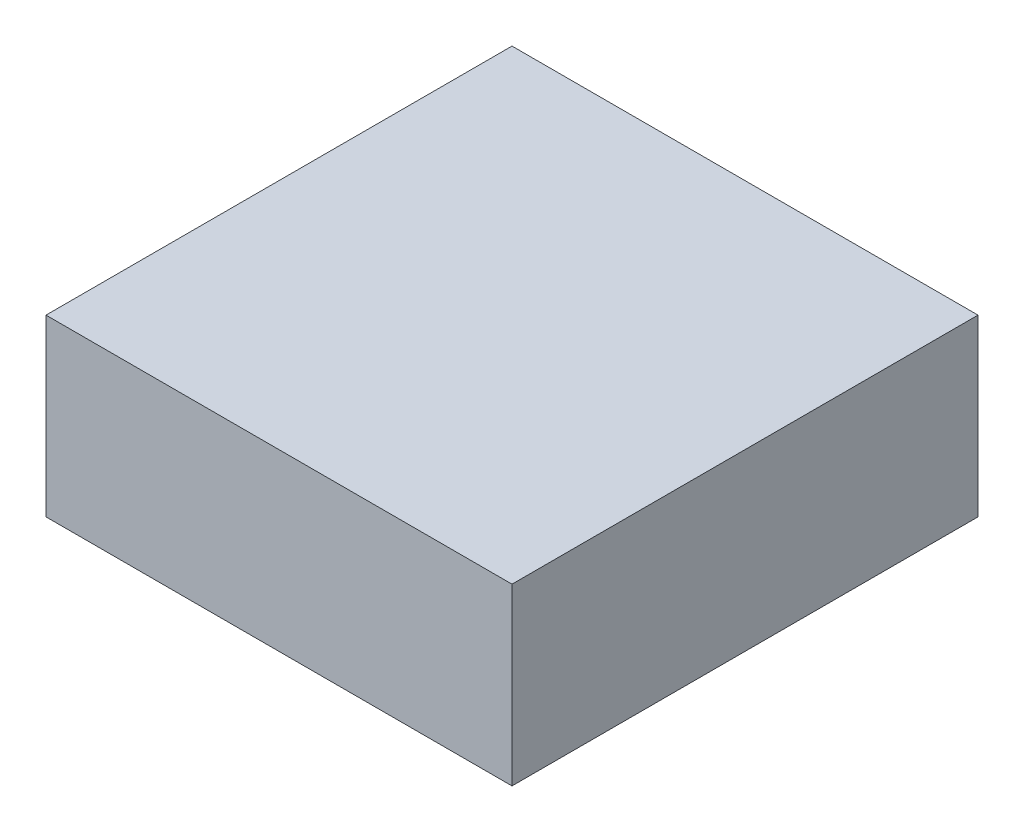
ISO-10303-21;
HEADER;
FILE_DESCRIPTION(('STEP AP214'),'2;1');
FILE_NAME('part.step','',(''),(''),'','','');
FILE_SCHEMA(('AUTOMOTIVE_DESIGN { 1 0 10303 214 1 1 1 1 }'));
ENDSEC;
DATA;
#1=APPLICATION_CONTEXT('core data for automotive mechanical design processes');
#2=APPLICATION_PROTOCOL_DEFINITION('international standard','automotive_design',2000,#1);
#3=PRODUCT_CONTEXT('',#1,'mechanical');
#4=PRODUCT('Part','Part','',(#3));
#5=PRODUCT_RELATED_PRODUCT_CATEGORY('part','',(#4));
#6=PRODUCT_DEFINITION_FORMATION('','',#4);
#7=PRODUCT_DEFINITION_CONTEXT('part definition',#1,'design');
#8=PRODUCT_DEFINITION('design','',#6,#7);
#9=PRODUCT_DEFINITION_SHAPE('','',#8);
#10=(LENGTH_UNIT() NAMED_UNIT(*) SI_UNIT(.MILLI.,.METRE.));
#11=(NAMED_UNIT(*) PLANE_ANGLE_UNIT() SI_UNIT($,.RADIAN.));
#12=(NAMED_UNIT(*) SI_UNIT($,.STERADIAN.) SOLID_ANGLE_UNIT());
#13=UNCERTAINTY_MEASURE_WITH_UNIT(LENGTH_MEASURE(1.E-05),#10,'distance_accuracy_value','');
#14=(GEOMETRIC_REPRESENTATION_CONTEXT(3) GLOBAL_UNCERTAINTY_ASSIGNED_CONTEXT((#13)) GLOBAL_UNIT_ASSIGNED_CONTEXT((#10,
#11,#12)) REPRESENTATION_CONTEXT('',''));
#15=CARTESIAN_POINT('',(0.,0.,0.));
#16=DIRECTION('',(0.,0.,1.));
#17=DIRECTION('',(1.,0.,0.));
#18=AXIS2_PLACEMENT_3D('',#15,#16,#17);
#19=CARTESIAN_POINT('',(16.,12.,-16.));
#20=DIRECTION('',(-1.,0.,0.));
#21=DIRECTION('',(0.,0.,1.));
#22=AXIS2_PLACEMENT_3D('',#19,#20,#21);
#23=PLANE('',#22);
#24=DIRECTION('',(0.,0.,-1.));
#25=VECTOR('',#24,1.);
#26=CARTESIAN_POINT('',(16.,0.,-16.));
#27=LINE('',#26,#25);
#28=CARTESIAN_POINT('',(16.,0.,16.));
#29=VERTEX_POINT('',#28);
#30=CARTESIAN_POINT('',(16.,0.,-16.));
#31=VERTEX_POINT('',#30);
#32=EDGE_CURVE('E100',#29,#31,#27,.T.);
#33=ORIENTED_EDGE('',*,*,#32,.T.);
#34=DIRECTION('',(0.,-1.,0.));
#35=VECTOR('',#34,1.);
#36=CARTESIAN_POINT('',(16.,12.,-16.));
#37=LINE('',#36,#35);
#38=CARTESIAN_POINT('',(16.,12.,-16.));
#39=VERTEX_POINT('',#38);
#40=EDGE_CURVE('E11',#39,#31,#37,.T.);
#41=ORIENTED_EDGE('',*,*,#40,.F.);
#42=DIRECTION('',(0.,0.,-1.));
#43=VECTOR('',#42,1.);
#44=CARTESIAN_POINT('',(16.,12.,-16.));
#45=LINE('',#44,#43);
#46=CARTESIAN_POINT('',(16.,12.,16.));
#47=VERTEX_POINT('',#46);
#48=EDGE_CURVE('E88',#47,#39,#45,.T.);
#49=ORIENTED_EDGE('',*,*,#48,.F.);
#50=DIRECTION('',(0.,-1.,0.));
#51=VECTOR('',#50,1.);
#52=CARTESIAN_POINT('',(16.,12.,16.));
#53=LINE('',#52,#51);
#54=EDGE_CURVE('E96',#47,#29,#53,.T.);
#55=ORIENTED_EDGE('',*,*,#54,.T.);
#56=EDGE_LOOP('',(#33,#41,#49,#55));
#57=FACE_BOUND('',#56,.T.);
#58=ADVANCED_FACE('F37',(#57),#23,.F.);
#59=CARTESIAN_POINT('',(-16.,12.,-16.));
#60=DIRECTION('',(0.,0.,1.));
#61=DIRECTION('',(1.,0.,0.));
#62=AXIS2_PLACEMENT_3D('',#59,#60,#61);
#63=PLANE('',#62);
#64=DIRECTION('',(-1.,0.,0.));
#65=VECTOR('',#64,1.);
#66=CARTESIAN_POINT('',(-16.,0.,-16.));
#67=LINE('',#66,#65);
#68=CARTESIAN_POINT('',(-16.,0.,-16.));
#69=VERTEX_POINT('',#68);
#70=EDGE_CURVE('E92',#31,#69,#67,.T.);
#71=ORIENTED_EDGE('',*,*,#70,.T.);
#72=DIRECTION('',(0.,-1.,0.));
#73=VECTOR('',#72,1.);
#74=CARTESIAN_POINT('',(-16.,12.,-16.));
#75=LINE('',#74,#73);
#76=CARTESIAN_POINT('',(-16.,12.,-16.));
#77=VERTEX_POINT('',#76);
#78=EDGE_CURVE('E45',#77,#69,#75,.T.);
#79=ORIENTED_EDGE('',*,*,#78,.F.);
#80=DIRECTION('',(-1.,0.,0.));
#81=VECTOR('',#80,1.);
#82=CARTESIAN_POINT('',(-16.,12.,-16.));
#83=LINE('',#82,#81);
#84=EDGE_CURVE('E83',#39,#77,#83,.T.);
#85=ORIENTED_EDGE('',*,*,#84,.F.);
#86=ORIENTED_EDGE('',*,*,#40,.T.);
#87=EDGE_LOOP('',(#71,#79,#85,#86));
#88=FACE_BOUND('',#87,.T.);
#89=ADVANCED_FACE('F91',(#88),#63,.F.);
#90=CARTESIAN_POINT('',(-16.,12.,-16.));
#91=DIRECTION('',(1.,0.,0.));
#92=DIRECTION('',(0.,0.,-1.));
#93=AXIS2_PLACEMENT_3D('',#90,#91,#92);
#94=PLANE('',#93);
#95=DIRECTION('',(0.,0.,1.));
#96=VECTOR('',#95,1.);
#97=CARTESIAN_POINT('',(-16.,0.,-16.));
#98=LINE('',#97,#96);
#99=CARTESIAN_POINT('',(-16.,0.,16.));
#100=VERTEX_POINT('',#99);
#101=EDGE_CURVE('E70',#69,#100,#98,.T.);
#102=ORIENTED_EDGE('',*,*,#101,.T.);
#103=DIRECTION('',(0.,-1.,0.));
#104=VECTOR('',#103,1.);
#105=CARTESIAN_POINT('',(-16.,12.,16.));
#106=LINE('',#105,#104);
#107=CARTESIAN_POINT('',(-16.,12.,16.));
#108=VERTEX_POINT('',#107);
#109=EDGE_CURVE('E93',#108,#100,#106,.T.);
#110=ORIENTED_EDGE('',*,*,#109,.F.);
#111=DIRECTION('',(0.,0.,1.));
#112=VECTOR('',#111,1.);
#113=CARTESIAN_POINT('',(-16.,12.,-16.));
#114=LINE('',#113,#112);
#115=EDGE_CURVE('E86',#77,#108,#114,.T.);
#116=ORIENTED_EDGE('',*,*,#115,.F.);
#117=ORIENTED_EDGE('',*,*,#78,.T.);
#118=EDGE_LOOP('',(#102,#110,#116,#117));
#119=FACE_BOUND('',#118,.T.);
#120=ADVANCED_FACE('F94',(#119),#94,.F.);
#121=CARTESIAN_POINT('',(-16.,12.,16.));
#122=DIRECTION('',(0.,0.,-1.));
#123=DIRECTION('',(-1.,0.,0.));
#124=AXIS2_PLACEMENT_3D('',#121,#122,#123);
#125=PLANE('',#124);
#126=DIRECTION('',(1.,0.,0.));
#127=VECTOR('',#126,1.);
#128=CARTESIAN_POINT('',(-16.,0.,16.));
#129=LINE('',#128,#127);
#130=EDGE_CURVE('E76',#100,#29,#129,.T.);
#131=ORIENTED_EDGE('',*,*,#130,.T.);
#132=ORIENTED_EDGE('',*,*,#54,.F.);
#133=DIRECTION('',(1.,0.,0.));
#134=VECTOR('',#133,1.);
#135=CARTESIAN_POINT('',(-16.,12.,16.));
#136=LINE('',#135,#134);
#137=EDGE_CURVE('E53',#108,#47,#136,.T.);
#138=ORIENTED_EDGE('',*,*,#137,.F.);
#139=ORIENTED_EDGE('',*,*,#109,.T.);
#140=EDGE_LOOP('',(#131,#132,#138,#139));
#141=FACE_BOUND('',#140,.T.);
#142=ADVANCED_FACE('F107',(#141),#125,.F.);
#143=CARTESIAN_POINT('',(0.,12.,0.));
#144=DIRECTION('',(0.,1.,0.));
#145=DIRECTION('',(0.,0.,1.));
#146=AXIS2_PLACEMENT_3D('',#143,#144,#145);
#147=PLANE('',#146);
#148=ORIENTED_EDGE('',*,*,#48,.T.);
#149=ORIENTED_EDGE('',*,*,#84,.T.);
#150=ORIENTED_EDGE('',*,*,#115,.T.);
#151=ORIENTED_EDGE('',*,*,#137,.T.);
#152=EDGE_LOOP('',(#148,#149,#150,#151));
#153=FACE_BOUND('',#152,.T.);
#154=ADVANCED_FACE('F84',(#153),#147,.T.);
#155=CARTESIAN_POINT('',(0.,0.,0.));
#156=DIRECTION('',(0.,1.,0.));
#157=DIRECTION('',(0.,0.,1.));
#158=AXIS2_PLACEMENT_3D('',#155,#156,#157);
#159=PLANE('',#158);
#160=ORIENTED_EDGE('',*,*,#32,.F.);
#161=ORIENTED_EDGE('',*,*,#130,.F.);
#162=ORIENTED_EDGE('',*,*,#101,.F.);
#163=ORIENTED_EDGE('',*,*,#70,.F.);
#164=EDGE_LOOP('',(#160,#161,#162,#163));
#165=FACE_BOUND('',#164,.T.);
#166=ADVANCED_FACE('F110',(#165),#159,.F.);
#167=CLOSED_SHELL('',(#58,#89,#120,#142,#154,#166));
#168=MANIFOLD_SOLID_BREP('B2',#167);
#169=ADVANCED_BREP_SHAPE_REPRESENTATION('',(#18,#168),#14);
#170=SHAPE_DEFINITION_REPRESENTATION(#9,#169);
ENDSEC;
END-ISO-10303-21;
